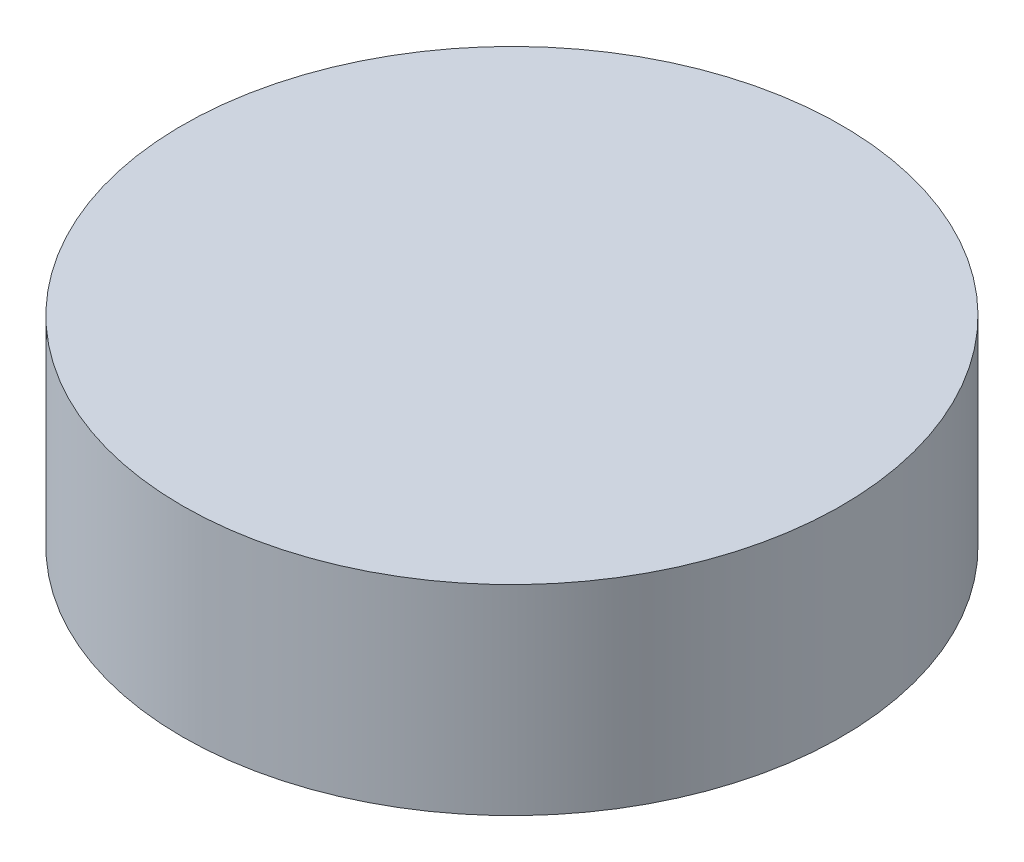
ISO-10303-21;
HEADER;
FILE_DESCRIPTION(('STEP AP214'),'2;1');
FILE_NAME('part.step','',(''),(''),'','','');
FILE_SCHEMA(('AUTOMOTIVE_DESIGN { 1 0 10303 214 1 1 1 1 }'));
ENDSEC;
DATA;
#1=APPLICATION_CONTEXT('core data for automotive mechanical design processes');
#2=APPLICATION_PROTOCOL_DEFINITION('international standard','automotive_design',2000,#1);
#3=PRODUCT_CONTEXT('',#1,'mechanical');
#4=PRODUCT('Part','Part','',(#3));
#5=PRODUCT_RELATED_PRODUCT_CATEGORY('part','',(#4));
#6=PRODUCT_DEFINITION_FORMATION('','',#4);
#7=PRODUCT_DEFINITION_CONTEXT('part definition',#1,'design');
#8=PRODUCT_DEFINITION('design','',#6,#7);
#9=PRODUCT_DEFINITION_SHAPE('','',#8);
#10=(LENGTH_UNIT() NAMED_UNIT(*) SI_UNIT(.MILLI.,.METRE.));
#11=(NAMED_UNIT(*) PLANE_ANGLE_UNIT() SI_UNIT($,.RADIAN.));
#12=(NAMED_UNIT(*) SI_UNIT($,.STERADIAN.) SOLID_ANGLE_UNIT());
#13=UNCERTAINTY_MEASURE_WITH_UNIT(LENGTH_MEASURE(1.E-05),#10,'distance_accuracy_value','');
#14=(GEOMETRIC_REPRESENTATION_CONTEXT(3) GLOBAL_UNCERTAINTY_ASSIGNED_CONTEXT((#13)) GLOBAL_UNIT_ASSIGNED_CONTEXT((#10,
#11,#12)) REPRESENTATION_CONTEXT('',''));
#15=CARTESIAN_POINT('',(0.,0.,0.));
#16=DIRECTION('',(0.,0.,1.));
#17=DIRECTION('',(1.,0.,0.));
#18=AXIS2_PLACEMENT_3D('',#15,#16,#17);
#19=CARTESIAN_POINT('',(-28.1409411397001,17.,14.8885211843762));
#20=DIRECTION('',(0.,-1.,0.));
#21=DIRECTION('',(0.,0.,-1.));
#22=AXIS2_PLACEMENT_3D('',#19,#20,#21);
#23=CYLINDRICAL_SURFACE('',#22,28.);
#24=CARTESIAN_POINT('',(-28.1409411397001,17.,14.8885211843762));
#25=DIRECTION('',(0.,1.,0.));
#26=DIRECTION('',(0.,0.,1.));
#27=AXIS2_PLACEMENT_3D('',#24,#25,#26);
#28=CIRCLE('',#27,28.);
#29=CARTESIAN_POINT('',(-28.1409411397001,17.,42.8885211843762));
#30=VERTEX_POINT('',#29);
#31=EDGE_CURVE('E10',#30,#30,#28,.T.);
#32=ORIENTED_EDGE('',*,*,#31,.F.);
#33=EDGE_LOOP('',(#32));
#34=FACE_BOUND('',#33,.T.);
#35=CARTESIAN_POINT('',(-28.1409411397001,0.,14.8885211843762));
#36=DIRECTION('',(0.,1.,0.));
#37=DIRECTION('',(0.,0.,1.));
#38=AXIS2_PLACEMENT_3D('',#35,#36,#37);
#39=CIRCLE('',#38,28.);
#40=CARTESIAN_POINT('',(-28.1409411397001,0.,42.8885211843762));
#41=VERTEX_POINT('',#40);
#42=EDGE_CURVE('E40',#41,#41,#39,.T.);
#43=ORIENTED_EDGE('',*,*,#42,.T.);
#44=EDGE_LOOP('',(#43));
#45=FACE_BOUND('',#44,.T.);
#46=ADVANCED_FACE('F37',(#34,#45),#23,.T.);
#47=CARTESIAN_POINT('',(-28.1409411397001,17.,14.8885211843762));
#48=DIRECTION('',(0.,1.,0.));
#49=DIRECTION('',(0.,0.,1.));
#50=AXIS2_PLACEMENT_3D('',#47,#48,#49);
#51=PLANE('',#50);
#52=ORIENTED_EDGE('',*,*,#31,.T.);
#53=EDGE_LOOP('',(#52));
#54=FACE_BOUND('',#53,.T.);
#55=ADVANCED_FACE('F54',(#54),#51,.T.);
#56=CARTESIAN_POINT('',(-28.1409411397001,0.,14.8885211843762));
#57=DIRECTION('',(0.,1.,0.));
#58=DIRECTION('',(0.,0.,1.));
#59=AXIS2_PLACEMENT_3D('',#56,#57,#58);
#60=PLANE('',#59);
#61=ORIENTED_EDGE('',*,*,#42,.F.);
#62=EDGE_LOOP('',(#61));
#63=FACE_BOUND('',#62,.T.);
#64=ADVANCED_FACE('F52',(#63),#60,.F.);
#65=CLOSED_SHELL('',(#46,#55,#64));
#66=MANIFOLD_SOLID_BREP('B2',#65);
#67=ADVANCED_BREP_SHAPE_REPRESENTATION('',(#18,#66),#14);
#68=SHAPE_DEFINITION_REPRESENTATION(#9,#67);
ENDSEC;
END-ISO-10303-21;
